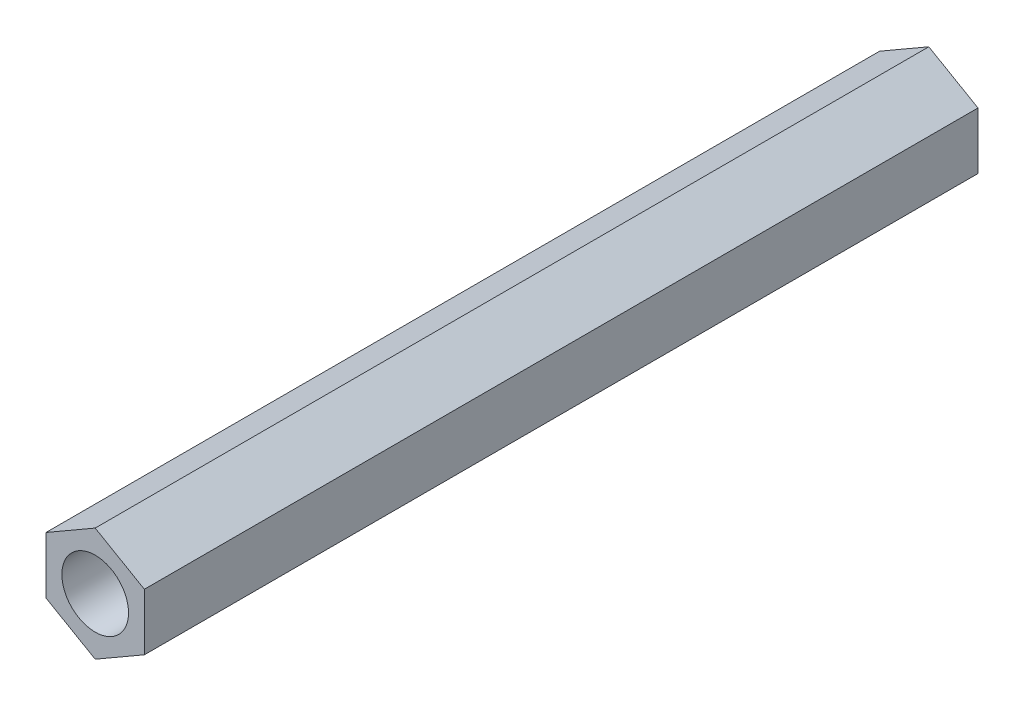
ISO-10303-21;
HEADER;
FILE_DESCRIPTION(('STEP AP214'),'2;1');
FILE_NAME('part.step','',(''),(''),'','','');
FILE_SCHEMA(('AUTOMOTIVE_DESIGN { 1 0 10303 214 1 1 1 1 }'));
ENDSEC;
DATA;
#1=APPLICATION_CONTEXT('core data for automotive mechanical design processes');
#2=APPLICATION_PROTOCOL_DEFINITION('international standard','automotive_design',2000,#1);
#3=PRODUCT_CONTEXT('',#1,'mechanical');
#4=PRODUCT('Part','Part','',(#3));
#5=PRODUCT_RELATED_PRODUCT_CATEGORY('part','',(#4));
#6=PRODUCT_DEFINITION_FORMATION('','',#4);
#7=PRODUCT_DEFINITION_CONTEXT('part definition',#1,'design');
#8=PRODUCT_DEFINITION('design','',#6,#7);
#9=PRODUCT_DEFINITION_SHAPE('','',#8);
#10=(LENGTH_UNIT() NAMED_UNIT(*) SI_UNIT(.MILLI.,.METRE.));
#11=(NAMED_UNIT(*) PLANE_ANGLE_UNIT() SI_UNIT($,.RADIAN.));
#12=(NAMED_UNIT(*) SI_UNIT($,.STERADIAN.) SOLID_ANGLE_UNIT());
#13=UNCERTAINTY_MEASURE_WITH_UNIT(LENGTH_MEASURE(1.E-05),#10,'distance_accuracy_value','');
#14=(GEOMETRIC_REPRESENTATION_CONTEXT(3) GLOBAL_UNCERTAINTY_ASSIGNED_CONTEXT((#13)) GLOBAL_UNIT_ASSIGNED_CONTEXT((#10,
#11,#12)) REPRESENTATION_CONTEXT('',''));
#15=CARTESIAN_POINT('',(0.,0.,0.));
#16=DIRECTION('',(0.,0.,1.));
#17=DIRECTION('',(1.,0.,0.));
#18=AXIS2_PLACEMENT_3D('',#15,#16,#17);
#19=CARTESIAN_POINT('',(0.,0.,50.));
#20=DIRECTION('',(0.,0.,1.));
#21=DIRECTION('',(1.,0.,0.));
#22=AXIS2_PLACEMENT_3D('',#19,#20,#21);
#23=PLANE('',#22);
#24=DIRECTION('',(0.866025403784439,0.5,0.));
#25=VECTOR('',#24,1.);
#26=CARTESIAN_POINT('',(0.,-3.40636658821879,50.));
#27=LINE('',#26,#25);
#28=CARTESIAN_POINT('',(0.,-3.40636658821879,50.));
#29=VERTEX_POINT('',#28);
#30=CARTESIAN_POINT('',(2.95,-1.7031832941094,50.));
#31=VERTEX_POINT('',#30);
#32=EDGE_CURVE('E154',#29,#31,#27,.T.);
#33=ORIENTED_EDGE('',*,*,#32,.T.);
#34=DIRECTION('',(0.,1.,0.));
#35=VECTOR('',#34,1.);
#36=CARTESIAN_POINT('',(2.95,-1.7031832941094,50.));
#37=LINE('',#36,#35);
#38=CARTESIAN_POINT('',(2.95,1.7031832941094,50.));
#39=VERTEX_POINT('',#38);
#40=EDGE_CURVE('E102',#31,#39,#37,.T.);
#41=ORIENTED_EDGE('',*,*,#40,.T.);
#42=DIRECTION('',(-0.866025403784439,0.5,0.));
#43=VECTOR('',#42,1.);
#44=CARTESIAN_POINT('',(2.95,1.7031832941094,50.));
#45=LINE('',#44,#43);
#46=CARTESIAN_POINT('',(0.,3.40636658821879,50.));
#47=VERTEX_POINT('',#46);
#48=EDGE_CURVE('E115',#39,#47,#45,.T.);
#49=ORIENTED_EDGE('',*,*,#48,.T.);
#50=DIRECTION('',(-0.866025403784439,-0.5,0.));
#51=VECTOR('',#50,1.);
#52=CARTESIAN_POINT('',(0.,3.40636658821879,50.));
#53=LINE('',#52,#51);
#54=CARTESIAN_POINT('',(-2.95,1.7031832941094,50.));
#55=VERTEX_POINT('',#54);
#56=EDGE_CURVE('E109',#47,#55,#53,.T.);
#57=ORIENTED_EDGE('',*,*,#56,.T.);
#58=DIRECTION('',(0.,-1.,0.));
#59=VECTOR('',#58,1.);
#60=CARTESIAN_POINT('',(-2.95,1.7031832941094,50.));
#61=LINE('',#60,#59);
#62=CARTESIAN_POINT('',(-2.95,-1.7031832941094,50.));
#63=VERTEX_POINT('',#62);
#64=EDGE_CURVE('E113',#55,#63,#61,.T.);
#65=ORIENTED_EDGE('',*,*,#64,.T.);
#66=DIRECTION('',(0.866025403784438,-0.5,0.));
#67=VECTOR('',#66,1.);
#68=CARTESIAN_POINT('',(-2.95,-1.7031832941094,50.));
#69=LINE('',#68,#67);
#70=EDGE_CURVE('E65',#63,#29,#69,.T.);
#71=ORIENTED_EDGE('',*,*,#70,.T.);
#72=EDGE_LOOP('',(#33,#41,#49,#57,#65,#71));
#73=FACE_BOUND('',#72,.T.);
#74=CARTESIAN_POINT('',(0.,0.,50.));
#75=DIRECTION('',(0.,0.,1.));
#76=DIRECTION('',(1.,0.,0.));
#77=AXIS2_PLACEMENT_3D('',#74,#75,#76);
#78=CIRCLE('',#77,2.);
#79=CARTESIAN_POINT('',(2.,0.,50.));
#80=VERTEX_POINT('',#79);
#81=EDGE_CURVE('E142',#80,#80,#78,.T.);
#82=ORIENTED_EDGE('',*,*,#81,.F.);
#83=EDGE_LOOP('',(#82));
#84=FACE_BOUND('',#83,.T.);
#85=ADVANCED_FACE('F47',(#73,#84),#23,.T.);
#86=CARTESIAN_POINT('',(0.,0.,0.));
#87=DIRECTION('',(0.,0.,1.));
#88=DIRECTION('',(1.,0.,0.));
#89=AXIS2_PLACEMENT_3D('',#86,#87,#88);
#90=PLANE('',#89);
#91=DIRECTION('',(0.866025403784439,0.5,0.));
#92=VECTOR('',#91,1.);
#93=CARTESIAN_POINT('',(0.,-3.40636658821879,0.));
#94=LINE('',#93,#92);
#95=CARTESIAN_POINT('',(0.,-3.40636658821879,0.));
#96=VERTEX_POINT('',#95);
#97=CARTESIAN_POINT('',(2.95,-1.7031832941094,0.));
#98=VERTEX_POINT('',#97);
#99=EDGE_CURVE('E137',#96,#98,#94,.T.);
#100=ORIENTED_EDGE('',*,*,#99,.F.);
#101=DIRECTION('',(0.866025403784438,-0.5,0.));
#102=VECTOR('',#101,1.);
#103=CARTESIAN_POINT('',(-2.95,-1.7031832941094,0.));
#104=LINE('',#103,#102);
#105=CARTESIAN_POINT('',(-2.95,-1.7031832941094,0.));
#106=VERTEX_POINT('',#105);
#107=EDGE_CURVE('E94',#106,#96,#104,.T.);
#108=ORIENTED_EDGE('',*,*,#107,.F.);
#109=DIRECTION('',(0.,-1.,0.));
#110=VECTOR('',#109,1.);
#111=CARTESIAN_POINT('',(-2.95,1.7031832941094,0.));
#112=LINE('',#111,#110);
#113=CARTESIAN_POINT('',(-2.95,1.7031832941094,0.));
#114=VERTEX_POINT('',#113);
#115=EDGE_CURVE('E88',#114,#106,#112,.T.);
#116=ORIENTED_EDGE('',*,*,#115,.F.);
#117=DIRECTION('',(-0.866025403784439,-0.5,0.));
#118=VECTOR('',#117,1.);
#119=CARTESIAN_POINT('',(0.,3.40636658821879,0.));
#120=LINE('',#119,#118);
#121=CARTESIAN_POINT('',(0.,3.40636658821879,0.));
#122=VERTEX_POINT('',#121);
#123=EDGE_CURVE('E124',#122,#114,#120,.T.);
#124=ORIENTED_EDGE('',*,*,#123,.F.);
#125=DIRECTION('',(-0.866025403784439,0.5,0.));
#126=VECTOR('',#125,1.);
#127=CARTESIAN_POINT('',(2.95,1.7031832941094,0.));
#128=LINE('',#127,#126);
#129=CARTESIAN_POINT('',(2.95,1.7031832941094,0.));
#130=VERTEX_POINT('',#129);
#131=EDGE_CURVE('E145',#130,#122,#128,.T.);
#132=ORIENTED_EDGE('',*,*,#131,.F.);
#133=DIRECTION('',(0.,1.,0.));
#134=VECTOR('',#133,1.);
#135=CARTESIAN_POINT('',(2.95,-1.7031832941094,0.));
#136=LINE('',#135,#134);
#137=EDGE_CURVE('E141',#98,#130,#136,.T.);
#138=ORIENTED_EDGE('',*,*,#137,.F.);
#139=EDGE_LOOP('',(#100,#108,#116,#124,#132,#138));
#140=FACE_BOUND('',#139,.T.);
#141=CARTESIAN_POINT('',(0.,0.,0.));
#142=DIRECTION('',(0.,0.,1.));
#143=DIRECTION('',(1.,0.,0.));
#144=AXIS2_PLACEMENT_3D('',#141,#142,#143);
#145=CIRCLE('',#144,2.);
#146=CARTESIAN_POINT('',(2.,0.,0.));
#147=VERTEX_POINT('',#146);
#148=EDGE_CURVE('E251',#147,#147,#145,.T.);
#149=ORIENTED_EDGE('',*,*,#148,.T.);
#150=EDGE_LOOP('',(#149));
#151=FACE_BOUND('',#150,.T.);
#152=ADVANCED_FACE('F167',(#140,#151),#90,.F.);
#153=CARTESIAN_POINT('',(0.,-3.40636658821879,50.));
#154=DIRECTION('',(-0.5,0.866025403784439,0.));
#155=DIRECTION('',(-0.866025403784439,-0.5,0.));
#156=AXIS2_PLACEMENT_3D('',#153,#154,#155);
#157=PLANE('',#156);
#158=ORIENTED_EDGE('',*,*,#99,.T.);
#159=DIRECTION('',(0.,0.,-1.));
#160=VECTOR('',#159,1.);
#161=CARTESIAN_POINT('',(2.95,-1.7031832941094,50.));
#162=LINE('',#161,#160);
#163=EDGE_CURVE('E11',#31,#98,#162,.T.);
#164=ORIENTED_EDGE('',*,*,#163,.F.);
#165=ORIENTED_EDGE('',*,*,#32,.F.);
#166=DIRECTION('',(0.,0.,-1.));
#167=VECTOR('',#166,1.);
#168=CARTESIAN_POINT('',(0.,-3.40636658821879,50.));
#169=LINE('',#168,#167);
#170=EDGE_CURVE('E133',#29,#96,#169,.T.);
#171=ORIENTED_EDGE('',*,*,#170,.T.);
#172=EDGE_LOOP('',(#158,#164,#165,#171));
#173=FACE_BOUND('',#172,.T.);
#174=ADVANCED_FACE('F49',(#173),#157,.F.);
#175=CARTESIAN_POINT('',(2.95,-1.7031832941094,50.));
#176=DIRECTION('',(-1.,0.,0.));
#177=DIRECTION('',(0.,0.,1.));
#178=AXIS2_PLACEMENT_3D('',#175,#176,#177);
#179=PLANE('',#178);
#180=ORIENTED_EDGE('',*,*,#137,.T.);
#181=DIRECTION('',(0.,0.,-1.));
#182=VECTOR('',#181,1.);
#183=CARTESIAN_POINT('',(2.95,1.7031832941094,50.));
#184=LINE('',#183,#182);
#185=EDGE_CURVE('E57',#39,#130,#184,.T.);
#186=ORIENTED_EDGE('',*,*,#185,.F.);
#187=ORIENTED_EDGE('',*,*,#40,.F.);
#188=ORIENTED_EDGE('',*,*,#163,.T.);
#189=EDGE_LOOP('',(#180,#186,#187,#188));
#190=FACE_BOUND('',#189,.T.);
#191=ADVANCED_FACE('F192',(#190),#179,.F.);
#192=CARTESIAN_POINT('',(2.95,1.7031832941094,50.));
#193=DIRECTION('',(-0.5,-0.866025403784439,0.));
#194=DIRECTION('',(0.866025403784439,-0.5,0.));
#195=AXIS2_PLACEMENT_3D('',#192,#193,#194);
#196=PLANE('',#195);
#197=ORIENTED_EDGE('',*,*,#131,.T.);
#198=DIRECTION('',(0.,0.,-1.));
#199=VECTOR('',#198,1.);
#200=CARTESIAN_POINT('',(0.,3.40636658821879,50.));
#201=LINE('',#200,#199);
#202=EDGE_CURVE('E126',#47,#122,#201,.T.);
#203=ORIENTED_EDGE('',*,*,#202,.F.);
#204=ORIENTED_EDGE('',*,*,#48,.F.);
#205=ORIENTED_EDGE('',*,*,#185,.T.);
#206=EDGE_LOOP('',(#197,#203,#204,#205));
#207=FACE_BOUND('',#206,.T.);
#208=ADVANCED_FACE('F164',(#207),#196,.F.);
#209=CARTESIAN_POINT('',(0.,3.40636658821879,50.));
#210=DIRECTION('',(0.5,-0.866025403784439,0.));
#211=DIRECTION('',(0.866025403784439,0.5,0.));
#212=AXIS2_PLACEMENT_3D('',#209,#210,#211);
#213=PLANE('',#212);
#214=ORIENTED_EDGE('',*,*,#123,.T.);
#215=DIRECTION('',(0.,0.,-1.));
#216=VECTOR('',#215,1.);
#217=CARTESIAN_POINT('',(-2.95,1.7031832941094,50.));
#218=LINE('',#217,#216);
#219=EDGE_CURVE('E121',#55,#114,#218,.T.);
#220=ORIENTED_EDGE('',*,*,#219,.F.);
#221=ORIENTED_EDGE('',*,*,#56,.F.);
#222=ORIENTED_EDGE('',*,*,#202,.T.);
#223=EDGE_LOOP('',(#214,#220,#221,#222));
#224=FACE_BOUND('',#223,.T.);
#225=ADVANCED_FACE('F122',(#224),#213,.F.);
#226=CARTESIAN_POINT('',(-2.95,1.7031832941094,50.));
#227=DIRECTION('',(1.,0.,0.));
#228=DIRECTION('',(0.,1.,0.));
#229=AXIS2_PLACEMENT_3D('',#226,#227,#228);
#230=PLANE('',#229);
#231=ORIENTED_EDGE('',*,*,#115,.T.);
#232=DIRECTION('',(0.,0.,-1.));
#233=VECTOR('',#232,1.);
#234=CARTESIAN_POINT('',(-2.95,-1.7031832941094,50.));
#235=LINE('',#234,#233);
#236=EDGE_CURVE('E127',#63,#106,#235,.T.);
#237=ORIENTED_EDGE('',*,*,#236,.F.);
#238=ORIENTED_EDGE('',*,*,#64,.F.);
#239=ORIENTED_EDGE('',*,*,#219,.T.);
#240=EDGE_LOOP('',(#231,#237,#238,#239));
#241=FACE_BOUND('',#240,.T.);
#242=ADVANCED_FACE('F129',(#241),#230,.F.);
#243=CARTESIAN_POINT('',(-2.95,-1.7031832941094,50.));
#244=DIRECTION('',(0.5,0.866025403784438,0.));
#245=DIRECTION('',(-0.866025403784439,0.5,0.));
#246=AXIS2_PLACEMENT_3D('',#243,#244,#245);
#247=PLANE('',#246);
#248=ORIENTED_EDGE('',*,*,#107,.T.);
#249=ORIENTED_EDGE('',*,*,#170,.F.);
#250=ORIENTED_EDGE('',*,*,#70,.F.);
#251=ORIENTED_EDGE('',*,*,#236,.T.);
#252=EDGE_LOOP('',(#248,#249,#250,#251));
#253=FACE_BOUND('',#252,.T.);
#254=ADVANCED_FACE('F172',(#253),#247,.F.);
#255=CARTESIAN_POINT('',(0.,0.,50.));
#256=DIRECTION('',(0.,0.,-1.));
#257=DIRECTION('',(-1.,0.,0.));
#258=AXIS2_PLACEMENT_3D('',#255,#256,#257);
#259=CYLINDRICAL_SURFACE('',#258,2.);
#260=ORIENTED_EDGE('',*,*,#81,.T.);
#261=EDGE_LOOP('',(#260));
#262=FACE_BOUND('',#261,.T.);
#263=ORIENTED_EDGE('',*,*,#148,.F.);
#264=EDGE_LOOP('',(#263));
#265=FACE_BOUND('',#264,.T.);
#266=ADVANCED_FACE('F174',(#262,#265),#259,.F.);
#267=CLOSED_SHELL('',(#85,#152,#174,#191,#208,#225,#242,#254,#266));
#268=MANIFOLD_SOLID_BREP('B2',#267);
#269=ADVANCED_BREP_SHAPE_REPRESENTATION('',(#18,#268),#14);
#270=SHAPE_DEFINITION_REPRESENTATION(#9,#269);
ENDSEC;
END-ISO-10303-21;
